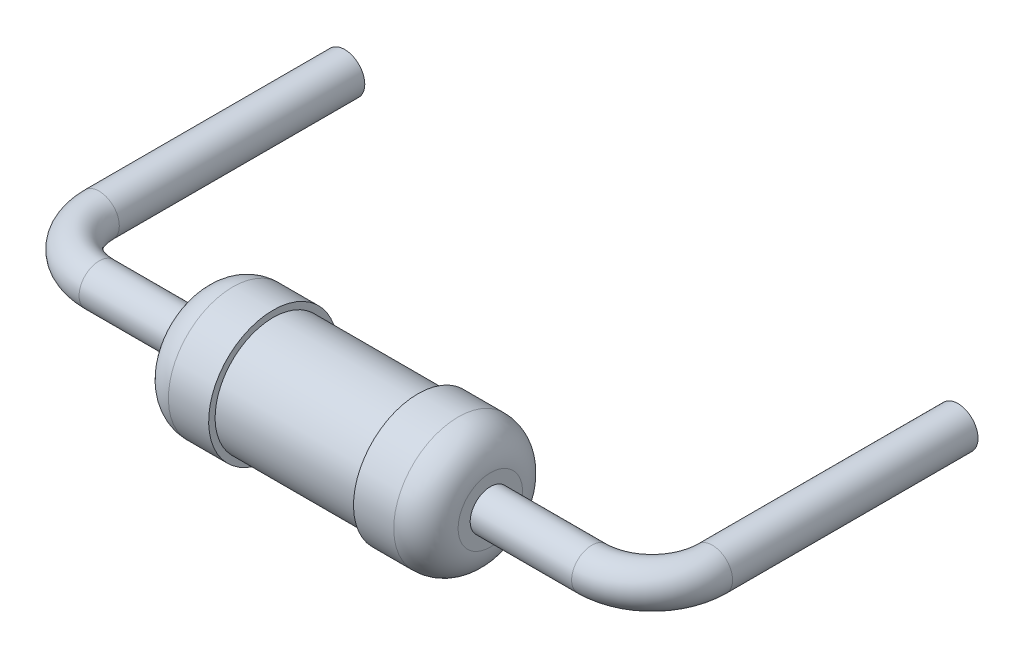
ISO-10303-21;
HEADER;
FILE_DESCRIPTION(('STEP AP214'),'2;1');
FILE_NAME('part.step','',(''),(''),'','','');
FILE_SCHEMA(('AUTOMOTIVE_DESIGN { 1 0 10303 214 1 1 1 1 }'));
ENDSEC;
DATA;
#1=APPLICATION_CONTEXT('core data for automotive mechanical design processes');
#2=APPLICATION_PROTOCOL_DEFINITION('international standard','automotive_design',2000,#1);
#3=PRODUCT_CONTEXT('',#1,'mechanical');
#4=PRODUCT('Part','Part','',(#3));
#5=PRODUCT_RELATED_PRODUCT_CATEGORY('part','',(#4));
#6=PRODUCT_DEFINITION_FORMATION('','',#4);
#7=PRODUCT_DEFINITION_CONTEXT('part definition',#1,'design');
#8=PRODUCT_DEFINITION('design','',#6,#7);
#9=PRODUCT_DEFINITION_SHAPE('','',#8);
#10=(LENGTH_UNIT() NAMED_UNIT(*) SI_UNIT(.MILLI.,.METRE.));
#11=(NAMED_UNIT(*) PLANE_ANGLE_UNIT() SI_UNIT($,.RADIAN.));
#12=(NAMED_UNIT(*) SI_UNIT($,.STERADIAN.) SOLID_ANGLE_UNIT());
#13=UNCERTAINTY_MEASURE_WITH_UNIT(LENGTH_MEASURE(1.E-05),#10,'distance_accuracy_value','');
#14=(GEOMETRIC_REPRESENTATION_CONTEXT(3) GLOBAL_UNCERTAINTY_ASSIGNED_CONTEXT((#13)) GLOBAL_UNIT_ASSIGNED_CONTEXT((#10,
#11,#12)) REPRESENTATION_CONTEXT('',''));
#15=CARTESIAN_POINT('',(0.,0.,0.));
#16=DIRECTION('',(0.,0.,1.));
#17=DIRECTION('',(1.,0.,0.));
#18=AXIS2_PLACEMENT_3D('',#15,#16,#17);
#19=CARTESIAN_POINT('',(2.01,0.,0.8));
#20=DIRECTION('',(-1.,0.,0.));
#21=DIRECTION('',(0.,1.,0.));
#22=AXIS2_PLACEMENT_3D('',#19,#20,#21);
#23=CYLINDRICAL_SURFACE('',#22,0.8);
#24=CARTESIAN_POINT('',(2.41,0.,0.8));
#25=DIRECTION('',(1.,0.,0.));
#26=DIRECTION('',(0.,1.,0.));
#27=AXIS2_PLACEMENT_3D('',#24,#25,#26);
#28=CIRCLE('',#27,0.8);
#29=CARTESIAN_POINT('',(2.41,0.8,0.8));
#30=VERTEX_POINT('',#29);
#31=EDGE_CURVE('E11',#30,#30,#28,.T.);
#32=ORIENTED_EDGE('',*,*,#31,.T.);
#33=DIRECTION('',(1.,0.,0.));
#34=VECTOR('',#33,1.);
#35=CARTESIAN_POINT('',(2.01,0.8,0.8));
#36=LINE('',#35,#34);
#37=CARTESIAN_POINT('',(2.91,0.8,0.8));
#38=VERTEX_POINT('',#37);
#39=EDGE_CURVE('E29',#30,#38,#36,.T.);
#40=ORIENTED_EDGE('',*,*,#39,.T.);
#41=CARTESIAN_POINT('',(2.91,0.,0.8));
#42=DIRECTION('',(1.,0.,0.));
#43=DIRECTION('',(0.,1.,0.));
#44=AXIS2_PLACEMENT_3D('',#41,#42,#43);
#45=CIRCLE('',#44,0.8);
#46=EDGE_CURVE('E142',#38,#38,#45,.T.);
#47=ORIENTED_EDGE('',*,*,#46,.F.);
#48=ORIENTED_EDGE('',*,*,#39,.F.);
#49=EDGE_LOOP('',(#32,#40,#47,#48));
#50=FACE_BOUND('',#49,.T.);
#51=ADVANCED_FACE('F18',(#50),#23,.T.);
#52=CARTESIAN_POINT('',(2.41,0.,0.8));
#53=DIRECTION('',(-1.,0.,0.));
#54=DIRECTION('',(0.,1.,0.));
#55=AXIS2_PLACEMENT_3D('',#52,#53,#54);
#56=DEGENERATE_TOROIDAL_SURFACE('',#55,0.4,0.4,.T.);
#57=CARTESIAN_POINT('',(2.01,0.,0.8));
#58=DIRECTION('',(1.,0.,0.));
#59=DIRECTION('',(0.,1.,0.));
#60=AXIS2_PLACEMENT_3D('',#57,#58,#59);
#61=CIRCLE('',#60,0.4);
#62=CARTESIAN_POINT('',(2.01,0.4,0.8));
#63=VERTEX_POINT('',#62);
#64=EDGE_CURVE('E133',#63,#63,#61,.T.);
#65=ORIENTED_EDGE('',*,*,#64,.T.);
#66=CARTESIAN_POINT('',(2.41,0.4,0.8));
#67=DIRECTION('',(0.,0.,1.));
#68=DIRECTION('',(0.,1.,0.));
#69=AXIS2_PLACEMENT_3D('',#66,#67,#68);
#70=CIRCLE('',#69,0.4);
#71=EDGE_CURVE('E137',#30,#63,#70,.T.);
#72=ORIENTED_EDGE('',*,*,#71,.F.);
#73=ORIENTED_EDGE('',*,*,#31,.F.);
#74=ORIENTED_EDGE('',*,*,#71,.T.);
#75=EDGE_LOOP('',(#65,#72,#73,#74));
#76=FACE_BOUND('',#75,.T.);
#77=ADVANCED_FACE('F235',(#76),#56,.T.);
#78=CARTESIAN_POINT('',(2.91,0.8,0.8));
#79=DIRECTION('',(-1.,0.,0.));
#80=DIRECTION('',(0.,0.,1.));
#81=AXIS2_PLACEMENT_3D('',#78,#79,#80);
#82=PLANE('',#81);
#83=ORIENTED_EDGE('',*,*,#46,.T.);
#84=EDGE_LOOP('',(#83));
#85=FACE_BOUND('',#84,.T.);
#86=CARTESIAN_POINT('',(2.91,0.,0.8));
#87=DIRECTION('',(-1.,0.,0.));
#88=DIRECTION('',(0.,1.,0.));
#89=AXIS2_PLACEMENT_3D('',#86,#87,#88);
#90=CIRCLE('',#89,0.72);
#91=CARTESIAN_POINT('',(2.91,0.72,0.8));
#92=VERTEX_POINT('',#91);
#93=EDGE_CURVE('E138',#92,#92,#90,.T.);
#94=ORIENTED_EDGE('',*,*,#93,.T.);
#95=EDGE_LOOP('',(#94));
#96=FACE_BOUND('',#95,.T.);
#97=ADVANCED_FACE('F20',(#85,#96),#82,.F.);
#98=CARTESIAN_POINT('',(2.01,0.8,0.8));
#99=DIRECTION('',(-1.,0.,0.));
#100=DIRECTION('',(0.,0.,1.));
#101=AXIS2_PLACEMENT_3D('',#98,#99,#100);
#102=PLANE('',#101);
#103=ORIENTED_EDGE('',*,*,#64,.F.);
#104=EDGE_LOOP('',(#103));
#105=FACE_BOUND('',#104,.T.);
#106=CARTESIAN_POINT('',(2.01,0.,0.8));
#107=DIRECTION('',(1.,0.,0.));
#108=DIRECTION('',(0.,0.,-1.));
#109=AXIS2_PLACEMENT_3D('',#106,#107,#108);
#110=CIRCLE('',#109,0.25);
#111=CARTESIAN_POINT('',(2.01,0.,0.55));
#112=VERTEX_POINT('',#111);
#113=EDGE_CURVE('E143',#112,#112,#110,.T.);
#114=ORIENTED_EDGE('',*,*,#113,.T.);
#115=EDGE_LOOP('',(#114));
#116=FACE_BOUND('',#115,.T.);
#117=ADVANCED_FACE('F246',(#105,#116),#102,.T.);
#118=CARTESIAN_POINT('',(2.01,0.,0.8));
#119=DIRECTION('',(-1.,0.,0.));
#120=DIRECTION('',(0.,1.,0.));
#121=AXIS2_PLACEMENT_3D('',#118,#119,#120);
#122=CYLINDRICAL_SURFACE('',#121,0.72);
#123=CARTESIAN_POINT('',(4.71,0.,0.8));
#124=DIRECTION('',(-1.,0.,0.));
#125=DIRECTION('',(0.,1.,0.));
#126=AXIS2_PLACEMENT_3D('',#123,#124,#125);
#127=CIRCLE('',#126,0.72);
#128=CARTESIAN_POINT('',(4.71,0.72,0.8));
#129=VERTEX_POINT('',#128);
#130=EDGE_CURVE('E150',#129,#129,#127,.T.);
#131=ORIENTED_EDGE('',*,*,#130,.T.);
#132=DIRECTION('',(1.,0.,0.));
#133=VECTOR('',#132,1.);
#134=CARTESIAN_POINT('',(2.01,0.72,0.8));
#135=LINE('',#134,#133);
#136=EDGE_CURVE('E154',#92,#129,#135,.T.);
#137=ORIENTED_EDGE('',*,*,#136,.F.);
#138=ORIENTED_EDGE('',*,*,#93,.F.);
#139=ORIENTED_EDGE('',*,*,#136,.T.);
#140=EDGE_LOOP('',(#131,#137,#138,#139));
#141=FACE_BOUND('',#140,.T.);
#142=ADVANCED_FACE('F249',(#141),#122,.T.);
#143=CARTESIAN_POINT('',(0.75,0.,0.8));
#144=DIRECTION('',(1.,0.,0.));
#145=DIRECTION('',(0.,0.,-1.));
#146=AXIS2_PLACEMENT_3D('',#143,#144,#145);
#147=CYLINDRICAL_SURFACE('',#146,0.25);
#148=CARTESIAN_POINT('',(0.75,0.,0.8));
#149=DIRECTION('',(-1.,0.,0.));
#150=DIRECTION('',(0.,0.,1.));
#151=AXIS2_PLACEMENT_3D('',#148,#149,#150);
#152=CIRCLE('',#151,0.25);
#153=CARTESIAN_POINT('',(0.75,0.,0.55));
#154=VERTEX_POINT('',#153);
#155=EDGE_CURVE('E104',#154,#154,#152,.T.);
#156=ORIENTED_EDGE('',*,*,#155,.F.);
#157=DIRECTION('',(1.,0.,0.));
#158=VECTOR('',#157,1.);
#159=CARTESIAN_POINT('',(0.75,0.,0.55));
#160=LINE('',#159,#158);
#161=EDGE_CURVE('E106',#154,#112,#160,.T.);
#162=ORIENTED_EDGE('',*,*,#161,.T.);
#163=ORIENTED_EDGE('',*,*,#113,.F.);
#164=ORIENTED_EDGE('',*,*,#161,.F.);
#165=EDGE_LOOP('',(#156,#162,#163,#164));
#166=FACE_BOUND('',#165,.T.);
#167=ADVANCED_FACE('F105',(#166),#147,.T.);
#168=CARTESIAN_POINT('',(4.71,0.8,0.8));
#169=DIRECTION('',(-1.,0.,0.));
#170=DIRECTION('',(0.,0.,1.));
#171=AXIS2_PLACEMENT_3D('',#168,#169,#170);
#172=PLANE('',#171);
#173=CARTESIAN_POINT('',(4.71,0.,0.8));
#174=DIRECTION('',(1.,0.,0.));
#175=DIRECTION('',(0.,1.,0.));
#176=AXIS2_PLACEMENT_3D('',#173,#174,#175);
#177=CIRCLE('',#176,0.8);
#178=CARTESIAN_POINT('',(4.71,0.8,0.8));
#179=VERTEX_POINT('',#178);
#180=EDGE_CURVE('E95',#179,#179,#177,.T.);
#181=ORIENTED_EDGE('',*,*,#180,.F.);
#182=EDGE_LOOP('',(#181));
#183=FACE_BOUND('',#182,.T.);
#184=ORIENTED_EDGE('',*,*,#130,.F.);
#185=EDGE_LOOP('',(#184));
#186=FACE_BOUND('',#185,.T.);
#187=ADVANCED_FACE('F252',(#183,#186),#172,.T.);
#188=CARTESIAN_POINT('',(0.75,0.,0.05));
#189=DIRECTION('',(0.,1.,0.));
#190=DIRECTION('',(-1.,0.,0.));
#191=AXIS2_PLACEMENT_3D('',#188,#189,#190);
#192=TOROIDAL_SURFACE('',#191,0.75,0.25);
#193=CARTESIAN_POINT('',(0.75,0.,0.05));
#194=DIRECTION('',(0.,1.,0.));
#195=DIRECTION('',(-1.,0.,0.));
#196=AXIS2_PLACEMENT_3D('',#193,#194,#195);
#197=CIRCLE('',#196,0.5);
#198=CARTESIAN_POINT('',(0.25,0.,0.05));
#199=VERTEX_POINT('',#198);
#200=EDGE_CURVE('E111',#199,#154,#197,.T.);
#201=ORIENTED_EDGE('',*,*,#200,.T.);
#202=ORIENTED_EDGE('',*,*,#155,.T.);
#203=ORIENTED_EDGE('',*,*,#200,.F.);
#204=CARTESIAN_POINT('',(0.,0.,0.05));
#205=DIRECTION('',(0.,0.,1.));
#206=DIRECTION('',(1.,0.,0.));
#207=AXIS2_PLACEMENT_3D('',#204,#205,#206);
#208=CIRCLE('',#207,0.25);
#209=EDGE_CURVE('E112',#199,#199,#208,.T.);
#210=ORIENTED_EDGE('',*,*,#209,.T.);
#211=EDGE_LOOP('',(#201,#202,#203,#210));
#212=FACE_BOUND('',#211,.T.);
#213=ADVANCED_FACE('F256',(#212),#192,.T.);
#214=CARTESIAN_POINT('',(4.71,0.,0.8));
#215=DIRECTION('',(-1.,0.,0.));
#216=DIRECTION('',(0.,1.,0.));
#217=AXIS2_PLACEMENT_3D('',#214,#215,#216);
#218=CYLINDRICAL_SURFACE('',#217,0.8);
#219=ORIENTED_EDGE('',*,*,#180,.T.);
#220=DIRECTION('',(1.,0.,0.));
#221=VECTOR('',#220,1.);
#222=CARTESIAN_POINT('',(4.71,0.8,0.8));
#223=LINE('',#222,#221);
#224=CARTESIAN_POINT('',(5.21,0.8,0.8));
#225=VERTEX_POINT('',#224);
#226=EDGE_CURVE('E131',#179,#225,#223,.T.);
#227=ORIENTED_EDGE('',*,*,#226,.T.);
#228=CARTESIAN_POINT('',(5.21,0.,0.8));
#229=DIRECTION('',(1.,0.,0.));
#230=DIRECTION('',(0.,1.,0.));
#231=AXIS2_PLACEMENT_3D('',#228,#229,#230);
#232=CIRCLE('',#231,0.8);
#233=EDGE_CURVE('E155',#225,#225,#232,.T.);
#234=ORIENTED_EDGE('',*,*,#233,.F.);
#235=ORIENTED_EDGE('',*,*,#226,.F.);
#236=EDGE_LOOP('',(#219,#227,#234,#235));
#237=FACE_BOUND('',#236,.T.);
#238=ADVANCED_FACE('F272',(#237),#218,.T.);
#239=CARTESIAN_POINT('',(0.,0.,-3.));
#240=DIRECTION('',(0.,0.,1.));
#241=DIRECTION('',(1.,0.,0.));
#242=AXIS2_PLACEMENT_3D('',#239,#240,#241);
#243=CYLINDRICAL_SURFACE('',#242,0.25);
#244=DIRECTION('',(0.,0.,1.));
#245=VECTOR('',#244,1.);
#246=CARTESIAN_POINT('',(0.25,0.,-3.));
#247=LINE('',#246,#245);
#248=CARTESIAN_POINT('',(0.25,0.,-3.));
#249=VERTEX_POINT('',#248);
#250=EDGE_CURVE('E127',#249,#199,#247,.T.);
#251=ORIENTED_EDGE('',*,*,#250,.T.);
#252=ORIENTED_EDGE('',*,*,#209,.F.);
#253=ORIENTED_EDGE('',*,*,#250,.F.);
#254=CARTESIAN_POINT('',(0.,0.,-3.));
#255=DIRECTION('',(0.,0.,1.));
#256=DIRECTION('',(1.,0.,0.));
#257=AXIS2_PLACEMENT_3D('',#254,#255,#256);
#258=CIRCLE('',#257,0.25);
#259=EDGE_CURVE('E132',#249,#249,#258,.T.);
#260=ORIENTED_EDGE('',*,*,#259,.T.);
#261=EDGE_LOOP('',(#251,#252,#253,#260));
#262=FACE_BOUND('',#261,.T.);
#263=ADVANCED_FACE('F244',(#262),#243,.T.);
#264=CARTESIAN_POINT('',(5.21,0.,0.8));
#265=DIRECTION('',(1.,0.,0.));
#266=DIRECTION('',(0.,1.,0.));
#267=AXIS2_PLACEMENT_3D('',#264,#265,#266);
#268=DEGENERATE_TOROIDAL_SURFACE('',#267,0.4,0.4,.T.);
#269=CARTESIAN_POINT('',(5.21,0.4,0.8));
#270=DIRECTION('',(0.,0.,-1.));
#271=DIRECTION('',(0.,1.,0.));
#272=AXIS2_PLACEMENT_3D('',#269,#270,#271);
#273=CIRCLE('',#272,0.4);
#274=CARTESIAN_POINT('',(5.61,0.4,0.8));
#275=VERTEX_POINT('',#274);
#276=EDGE_CURVE('E159',#225,#275,#273,.T.);
#277=ORIENTED_EDGE('',*,*,#276,.F.);
#278=ORIENTED_EDGE('',*,*,#233,.T.);
#279=ORIENTED_EDGE('',*,*,#276,.T.);
#280=CARTESIAN_POINT('',(5.61,0.,0.8));
#281=DIRECTION('',(1.,0.,0.));
#282=DIRECTION('',(0.,1.,0.));
#283=AXIS2_PLACEMENT_3D('',#280,#281,#282);
#284=CIRCLE('',#283,0.4);
#285=EDGE_CURVE('E176',#275,#275,#284,.T.);
#286=ORIENTED_EDGE('',*,*,#285,.F.);
#287=EDGE_LOOP('',(#277,#278,#279,#286));
#288=FACE_BOUND('',#287,.T.);
#289=ADVANCED_FACE('F230',(#288),#268,.T.);
#290=CARTESIAN_POINT('',(0.25,0.,-3.));
#291=DIRECTION('',(0.,0.,-1.));
#292=DIRECTION('',(0.,-1.,0.));
#293=AXIS2_PLACEMENT_3D('',#290,#291,#292);
#294=PLANE('',#293);
#295=ORIENTED_EDGE('',*,*,#259,.F.);
#296=EDGE_LOOP('',(#295));
#297=FACE_BOUND('',#296,.T.);
#298=ADVANCED_FACE('F221',(#297),#294,.T.);
#299=CARTESIAN_POINT('',(5.61,0.8,0.8));
#300=DIRECTION('',(-1.,0.,0.));
#301=DIRECTION('',(0.,0.,1.));
#302=AXIS2_PLACEMENT_3D('',#299,#300,#301);
#303=PLANE('',#302);
#304=ORIENTED_EDGE('',*,*,#285,.T.);
#305=EDGE_LOOP('',(#304));
#306=FACE_BOUND('',#305,.T.);
#307=CARTESIAN_POINT('',(5.61,0.,0.8));
#308=DIRECTION('',(1.,0.,0.));
#309=DIRECTION('',(0.,0.,-1.));
#310=AXIS2_PLACEMENT_3D('',#307,#308,#309);
#311=CIRCLE('',#310,0.25);
#312=CARTESIAN_POINT('',(5.61,0.,0.55));
#313=VERTEX_POINT('',#312);
#314=EDGE_CURVE('E185',#313,#313,#311,.T.);
#315=ORIENTED_EDGE('',*,*,#314,.F.);
#316=EDGE_LOOP('',(#315));
#317=FACE_BOUND('',#316,.T.);
#318=ADVANCED_FACE('F219',(#306,#317),#303,.F.);
#319=CARTESIAN_POINT('',(0.75,0.,0.8));
#320=DIRECTION('',(1.,0.,0.));
#321=DIRECTION('',(0.,0.,-1.));
#322=AXIS2_PLACEMENT_3D('',#319,#320,#321);
#323=CYLINDRICAL_SURFACE('',#322,0.25);
#324=ORIENTED_EDGE('',*,*,#314,.T.);
#325=DIRECTION('',(1.,0.,0.));
#326=VECTOR('',#325,1.);
#327=CARTESIAN_POINT('',(0.75,0.,0.55));
#328=LINE('',#327,#326);
#329=CARTESIAN_POINT('',(6.87,0.,0.55));
#330=VERTEX_POINT('',#329);
#331=EDGE_CURVE('E193',#313,#330,#328,.T.);
#332=ORIENTED_EDGE('',*,*,#331,.T.);
#333=CARTESIAN_POINT('',(6.87,0.,0.8));
#334=DIRECTION('',(1.,0.,0.));
#335=DIRECTION('',(0.,0.,-1.));
#336=AXIS2_PLACEMENT_3D('',#333,#334,#335);
#337=CIRCLE('',#336,0.25);
#338=EDGE_CURVE('E126',#330,#330,#337,.T.);
#339=ORIENTED_EDGE('',*,*,#338,.F.);
#340=ORIENTED_EDGE('',*,*,#331,.F.);
#341=EDGE_LOOP('',(#324,#332,#339,#340));
#342=FACE_BOUND('',#341,.T.);
#343=ADVANCED_FACE('F217',(#342),#323,.T.);
#344=CARTESIAN_POINT('',(6.87,0.,0.05));
#345=DIRECTION('',(0.,1.,0.));
#346=DIRECTION('',(0.,0.,1.));
#347=AXIS2_PLACEMENT_3D('',#344,#345,#346);
#348=TOROIDAL_SURFACE('',#347,0.75,0.25);
#349=CARTESIAN_POINT('',(6.87,0.,0.05));
#350=DIRECTION('',(0.,1.,0.));
#351=DIRECTION('',(0.,0.,1.));
#352=AXIS2_PLACEMENT_3D('',#349,#350,#351);
#353=CIRCLE('',#352,0.5);
#354=CARTESIAN_POINT('',(7.37,0.,0.05));
#355=VERTEX_POINT('',#354);
#356=EDGE_CURVE('E125',#330,#355,#353,.T.);
#357=ORIENTED_EDGE('',*,*,#356,.T.);
#358=CARTESIAN_POINT('',(7.62,0.,0.05));
#359=DIRECTION('',(0.,0.,1.));
#360=DIRECTION('',(1.,0.,0.));
#361=AXIS2_PLACEMENT_3D('',#358,#359,#360);
#362=CIRCLE('',#361,0.25);
#363=EDGE_CURVE('E122',#355,#355,#362,.T.);
#364=ORIENTED_EDGE('',*,*,#363,.T.);
#365=ORIENTED_EDGE('',*,*,#356,.F.);
#366=ORIENTED_EDGE('',*,*,#338,.T.);
#367=EDGE_LOOP('',(#357,#364,#365,#366));
#368=FACE_BOUND('',#367,.T.);
#369=ADVANCED_FACE('F214',(#368),#348,.T.);
#370=CARTESIAN_POINT('',(7.62,0.,0.05));
#371=DIRECTION('',(0.,0.,-1.));
#372=DIRECTION('',(-1.,0.,0.));
#373=AXIS2_PLACEMENT_3D('',#370,#371,#372);
#374=CYLINDRICAL_SURFACE('',#373,0.25);
#375=DIRECTION('',(0.,0.,-1.));
#376=VECTOR('',#375,1.);
#377=CARTESIAN_POINT('',(7.37,0.,0.05));
#378=LINE('',#377,#376);
#379=CARTESIAN_POINT('',(7.37,0.,-3.));
#380=VERTEX_POINT('',#379);
#381=EDGE_CURVE('E180',#355,#380,#378,.T.);
#382=ORIENTED_EDGE('',*,*,#381,.T.);
#383=CARTESIAN_POINT('',(7.62,0.,-3.));
#384=DIRECTION('',(0.,0.,-1.));
#385=DIRECTION('',(-1.,0.,0.));
#386=AXIS2_PLACEMENT_3D('',#383,#384,#385);
#387=CIRCLE('',#386,0.25);
#388=EDGE_CURVE('E22',#380,#380,#387,.T.);
#389=ORIENTED_EDGE('',*,*,#388,.F.);
#390=ORIENTED_EDGE('',*,*,#381,.F.);
#391=ORIENTED_EDGE('',*,*,#363,.F.);
#392=EDGE_LOOP('',(#382,#389,#390,#391));
#393=FACE_BOUND('',#392,.T.);
#394=ADVANCED_FACE('F211',(#393),#374,.T.);
#395=CARTESIAN_POINT('',(7.37,0.,-3.));
#396=DIRECTION('',(0.,0.,1.));
#397=DIRECTION('',(1.,0.,0.));
#398=AXIS2_PLACEMENT_3D('',#395,#396,#397);
#399=PLANE('',#398);
#400=ORIENTED_EDGE('',*,*,#388,.T.);
#401=EDGE_LOOP('',(#400));
#402=FACE_BOUND('',#401,.T.);
#403=ADVANCED_FACE('F210',(#402),#399,.F.);
#404=CLOSED_SHELL('',(#51,#77,#97,#117,#142,#167,#187,#213,#238,#263,#289,#298,#318,#343,#369,
#394,#403));
#405=MANIFOLD_SOLID_BREP('B1',#404);
#406=ADVANCED_BREP_SHAPE_REPRESENTATION('',(#18,#405),#14);
#407=SHAPE_DEFINITION_REPRESENTATION(#9,#406);
ENDSEC;
END-ISO-10303-21;
